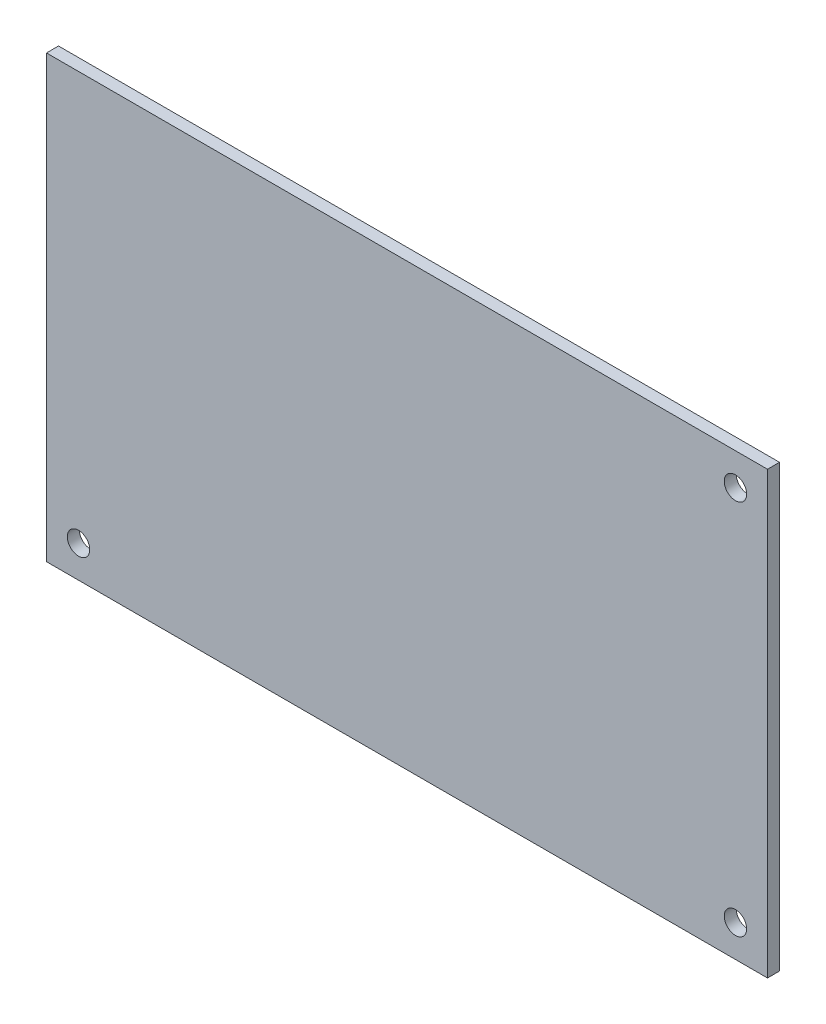
ISO-10303-21;
HEADER;
FILE_DESCRIPTION(('STEP AP214'),'2;1');
FILE_NAME('part.step','',(''),(''),'','','');
FILE_SCHEMA(('AUTOMOTIVE_DESIGN { 1 0 10303 214 1 1 1 1 }'));
ENDSEC;
DATA;
#1=APPLICATION_CONTEXT('core data for automotive mechanical design processes');
#2=APPLICATION_PROTOCOL_DEFINITION('international standard','automotive_design',2000,#1);
#3=PRODUCT_CONTEXT('',#1,'mechanical');
#4=PRODUCT('Part','Part','',(#3));
#5=PRODUCT_RELATED_PRODUCT_CATEGORY('part','',(#4));
#6=PRODUCT_DEFINITION_FORMATION('','',#4);
#7=PRODUCT_DEFINITION_CONTEXT('part definition',#1,'design');
#8=PRODUCT_DEFINITION('design','',#6,#7);
#9=PRODUCT_DEFINITION_SHAPE('','',#8);
#10=(LENGTH_UNIT() NAMED_UNIT(*) SI_UNIT(.MILLI.,.METRE.));
#11=(NAMED_UNIT(*) PLANE_ANGLE_UNIT() SI_UNIT($,.RADIAN.));
#12=(NAMED_UNIT(*) SI_UNIT($,.STERADIAN.) SOLID_ANGLE_UNIT());
#13=UNCERTAINTY_MEASURE_WITH_UNIT(LENGTH_MEASURE(1.E-05),#10,'distance_accuracy_value','');
#14=(GEOMETRIC_REPRESENTATION_CONTEXT(3) GLOBAL_UNCERTAINTY_ASSIGNED_CONTEXT((#13)) GLOBAL_UNIT_ASSIGNED_CONTEXT((#10,
#11,#12)) REPRESENTATION_CONTEXT('',''));
#15=CARTESIAN_POINT('',(0.,0.,0.));
#16=DIRECTION('',(0.,0.,1.));
#17=DIRECTION('',(1.,0.,0.));
#18=AXIS2_PLACEMENT_3D('',#15,#16,#17);
#19=CARTESIAN_POINT('',(45.,-27.5,1.5));
#20=DIRECTION('',(-1.,0.,0.));
#21=DIRECTION('',(0.,0.,1.));
#22=AXIS2_PLACEMENT_3D('',#19,#20,#21);
#23=PLANE('',#22);
#24=DIRECTION('',(0.,1.,0.));
#25=VECTOR('',#24,1.);
#26=CARTESIAN_POINT('',(45.,-27.5,0.));
#27=LINE('',#26,#25);
#28=CARTESIAN_POINT('',(45.,-27.5,0.));
#29=VERTEX_POINT('',#28);
#30=CARTESIAN_POINT('',(45.,27.5,0.));
#31=VERTEX_POINT('',#30);
#32=EDGE_CURVE('E96',#29,#31,#27,.T.);
#33=ORIENTED_EDGE('',*,*,#32,.T.);
#34=DIRECTION('',(0.,0.,-1.));
#35=VECTOR('',#34,1.);
#36=CARTESIAN_POINT('',(45.,27.5,1.5));
#37=LINE('',#36,#35);
#38=CARTESIAN_POINT('',(45.,27.5,1.5));
#39=VERTEX_POINT('',#38);
#40=EDGE_CURVE('E11',#39,#31,#37,.T.);
#41=ORIENTED_EDGE('',*,*,#40,.F.);
#42=DIRECTION('',(0.,1.,0.));
#43=VECTOR('',#42,1.);
#44=CARTESIAN_POINT('',(45.,-27.5,1.5));
#45=LINE('',#44,#43);
#46=CARTESIAN_POINT('',(45.,-27.5,1.5));
#47=VERTEX_POINT('',#46);
#48=EDGE_CURVE('E84',#47,#39,#45,.T.);
#49=ORIENTED_EDGE('',*,*,#48,.F.);
#50=DIRECTION('',(0.,0.,-1.));
#51=VECTOR('',#50,1.);
#52=CARTESIAN_POINT('',(45.,-27.5,1.5));
#53=LINE('',#52,#51);
#54=EDGE_CURVE('E92',#47,#29,#53,.T.);
#55=ORIENTED_EDGE('',*,*,#54,.T.);
#56=EDGE_LOOP('',(#33,#41,#49,#55));
#57=FACE_BOUND('',#56,.T.);
#58=ADVANCED_FACE('F33',(#57),#23,.F.);
#59=CARTESIAN_POINT('',(-45.,27.5,1.5));
#60=DIRECTION('',(0.,-1.,0.));
#61=DIRECTION('',(0.,0.,-1.));
#62=AXIS2_PLACEMENT_3D('',#59,#60,#61);
#63=PLANE('',#62);
#64=DIRECTION('',(-1.,0.,0.));
#65=VECTOR('',#64,1.);
#66=CARTESIAN_POINT('',(-45.,27.5,0.));
#67=LINE('',#66,#65);
#68=CARTESIAN_POINT('',(-45.,27.5,0.));
#69=VERTEX_POINT('',#68);
#70=EDGE_CURVE('E88',#31,#69,#67,.T.);
#71=ORIENTED_EDGE('',*,*,#70,.T.);
#72=DIRECTION('',(0.,0.,-1.));
#73=VECTOR('',#72,1.);
#74=CARTESIAN_POINT('',(-45.,27.5,1.5));
#75=LINE('',#74,#73);
#76=CARTESIAN_POINT('',(-45.,27.5,1.5));
#77=VERTEX_POINT('',#76);
#78=EDGE_CURVE('E41',#77,#69,#75,.T.);
#79=ORIENTED_EDGE('',*,*,#78,.F.);
#80=DIRECTION('',(-1.,0.,0.));
#81=VECTOR('',#80,1.);
#82=CARTESIAN_POINT('',(-45.,27.5,1.5));
#83=LINE('',#82,#81);
#84=EDGE_CURVE('E79',#39,#77,#83,.T.);
#85=ORIENTED_EDGE('',*,*,#84,.F.);
#86=ORIENTED_EDGE('',*,*,#40,.T.);
#87=EDGE_LOOP('',(#71,#79,#85,#86));
#88=FACE_BOUND('',#87,.T.);
#89=ADVANCED_FACE('F87',(#88),#63,.F.);
#90=CARTESIAN_POINT('',(-45.,-27.5,1.5));
#91=DIRECTION('',(1.,0.,0.));
#92=DIRECTION('',(0.,0.,-1.));
#93=AXIS2_PLACEMENT_3D('',#90,#91,#92);
#94=PLANE('',#93);
#95=DIRECTION('',(0.,-1.,0.));
#96=VECTOR('',#95,1.);
#97=CARTESIAN_POINT('',(-45.,-27.5,0.));
#98=LINE('',#97,#96);
#99=CARTESIAN_POINT('',(-45.,-27.5,0.));
#100=VERTEX_POINT('',#99);
#101=EDGE_CURVE('E66',#69,#100,#98,.T.);
#102=ORIENTED_EDGE('',*,*,#101,.T.);
#103=DIRECTION('',(0.,0.,-1.));
#104=VECTOR('',#103,1.);
#105=CARTESIAN_POINT('',(-45.,-27.5,1.5));
#106=LINE('',#105,#104);
#107=CARTESIAN_POINT('',(-45.,-27.5,1.5));
#108=VERTEX_POINT('',#107);
#109=EDGE_CURVE('E89',#108,#100,#106,.T.);
#110=ORIENTED_EDGE('',*,*,#109,.F.);
#111=DIRECTION('',(0.,-1.,0.));
#112=VECTOR('',#111,1.);
#113=CARTESIAN_POINT('',(-45.,-27.5,1.5));
#114=LINE('',#113,#112);
#115=EDGE_CURVE('E82',#77,#108,#114,.T.);
#116=ORIENTED_EDGE('',*,*,#115,.F.);
#117=ORIENTED_EDGE('',*,*,#78,.T.);
#118=EDGE_LOOP('',(#102,#110,#116,#117));
#119=FACE_BOUND('',#118,.T.);
#120=ADVANCED_FACE('F90',(#119),#94,.F.);
#121=CARTESIAN_POINT('',(-45.,-27.5,1.5));
#122=DIRECTION('',(0.,1.,0.));
#123=DIRECTION('',(0.,0.,1.));
#124=AXIS2_PLACEMENT_3D('',#121,#122,#123);
#125=PLANE('',#124);
#126=DIRECTION('',(1.,0.,0.));
#127=VECTOR('',#126,1.);
#128=CARTESIAN_POINT('',(-45.,-27.5,0.));
#129=LINE('',#128,#127);
#130=EDGE_CURVE('E72',#100,#29,#129,.T.);
#131=ORIENTED_EDGE('',*,*,#130,.T.);
#132=ORIENTED_EDGE('',*,*,#54,.F.);
#133=DIRECTION('',(1.,0.,0.));
#134=VECTOR('',#133,1.);
#135=CARTESIAN_POINT('',(-45.,-27.5,1.5));
#136=LINE('',#135,#134);
#137=EDGE_CURVE('E49',#108,#47,#136,.T.);
#138=ORIENTED_EDGE('',*,*,#137,.F.);
#139=ORIENTED_EDGE('',*,*,#109,.T.);
#140=EDGE_LOOP('',(#131,#132,#138,#139));
#141=FACE_BOUND('',#140,.T.);
#142=ADVANCED_FACE('F104',(#141),#125,.F.);
#143=CARTESIAN_POINT('',(0.,0.,1.5));
#144=DIRECTION('',(0.,0.,-1.));
#145=DIRECTION('',(-1.,0.,0.));
#146=AXIS2_PLACEMENT_3D('',#143,#144,#145);
#147=PLANE('',#146);
#148=CARTESIAN_POINT('',(-41.,-23.5,1.5));
#149=DIRECTION('',(0.,0.,1.));
#150=DIRECTION('',(1.,0.,0.));
#151=AXIS2_PLACEMENT_3D('',#148,#149,#150);
#152=CIRCLE('',#151,1.4);
#153=CARTESIAN_POINT('',(-39.6,-23.5,1.5));
#154=VERTEX_POINT('',#153);
#155=EDGE_CURVE('E122',#154,#154,#152,.T.);
#156=ORIENTED_EDGE('',*,*,#155,.F.);
#157=EDGE_LOOP('',(#156));
#158=FACE_BOUND('',#157,.T.);
#159=CARTESIAN_POINT('',(41.,23.5,1.5));
#160=DIRECTION('',(0.,0.,1.));
#161=DIRECTION('',(1.,0.,0.));
#162=AXIS2_PLACEMENT_3D('',#159,#160,#161);
#163=CIRCLE('',#162,1.4);
#164=CARTESIAN_POINT('',(42.4,23.5,1.5));
#165=VERTEX_POINT('',#164);
#166=EDGE_CURVE('E116',#165,#165,#163,.T.);
#167=ORIENTED_EDGE('',*,*,#166,.F.);
#168=EDGE_LOOP('',(#167));
#169=FACE_BOUND('',#168,.T.);
#170=CARTESIAN_POINT('',(41.,-23.5,1.5));
#171=DIRECTION('',(0.,0.,1.));
#172=DIRECTION('',(1.,0.,0.));
#173=AXIS2_PLACEMENT_3D('',#170,#171,#172);
#174=CIRCLE('',#173,1.4);
#175=CARTESIAN_POINT('',(42.4,-23.5,1.5));
#176=VERTEX_POINT('',#175);
#177=EDGE_CURVE('E110',#176,#176,#174,.T.);
#178=ORIENTED_EDGE('',*,*,#177,.F.);
#179=EDGE_LOOP('',(#178));
#180=FACE_BOUND('',#179,.T.);
#181=ORIENTED_EDGE('',*,*,#48,.T.);
#182=ORIENTED_EDGE('',*,*,#84,.T.);
#183=ORIENTED_EDGE('',*,*,#115,.T.);
#184=ORIENTED_EDGE('',*,*,#137,.T.);
#185=EDGE_LOOP('',(#181,#182,#183,#184));
#186=FACE_BOUND('',#185,.T.);
#187=ADVANCED_FACE('F80',(#158,#169,#180,#186),#147,.F.);
#188=CARTESIAN_POINT('',(0.,0.,0.));
#189=DIRECTION('',(0.,0.,-1.));
#190=DIRECTION('',(-1.,0.,0.));
#191=AXIS2_PLACEMENT_3D('',#188,#189,#190);
#192=PLANE('',#191);
#193=CARTESIAN_POINT('',(-41.,-23.5,0.));
#194=DIRECTION('',(0.,0.,1.));
#195=DIRECTION('',(1.,0.,0.));
#196=AXIS2_PLACEMENT_3D('',#193,#194,#195);
#197=CIRCLE('',#196,1.4);
#198=CARTESIAN_POINT('',(-39.6,-23.5,0.));
#199=VERTEX_POINT('',#198);
#200=EDGE_CURVE('E113',#199,#199,#197,.T.);
#201=ORIENTED_EDGE('',*,*,#200,.T.);
#202=EDGE_LOOP('',(#201));
#203=FACE_BOUND('',#202,.T.);
#204=CARTESIAN_POINT('',(41.,23.5,0.));
#205=DIRECTION('',(0.,0.,1.));
#206=DIRECTION('',(1.,0.,0.));
#207=AXIS2_PLACEMENT_3D('',#204,#205,#206);
#208=CIRCLE('',#207,1.4);
#209=CARTESIAN_POINT('',(42.4,23.5,0.));
#210=VERTEX_POINT('',#209);
#211=EDGE_CURVE('E119',#210,#210,#208,.T.);
#212=ORIENTED_EDGE('',*,*,#211,.T.);
#213=EDGE_LOOP('',(#212));
#214=FACE_BOUND('',#213,.T.);
#215=CARTESIAN_POINT('',(41.,-23.5,0.));
#216=DIRECTION('',(0.,0.,1.));
#217=DIRECTION('',(1.,0.,0.));
#218=AXIS2_PLACEMENT_3D('',#215,#216,#217);
#219=CIRCLE('',#218,1.4);
#220=CARTESIAN_POINT('',(42.4,-23.5,0.));
#221=VERTEX_POINT('',#220);
#222=EDGE_CURVE('E99',#221,#221,#219,.T.);
#223=ORIENTED_EDGE('',*,*,#222,.T.);
#224=EDGE_LOOP('',(#223));
#225=FACE_BOUND('',#224,.T.);
#226=ORIENTED_EDGE('',*,*,#32,.F.);
#227=ORIENTED_EDGE('',*,*,#130,.F.);
#228=ORIENTED_EDGE('',*,*,#101,.F.);
#229=ORIENTED_EDGE('',*,*,#70,.F.);
#230=EDGE_LOOP('',(#226,#227,#228,#229));
#231=FACE_BOUND('',#230,.T.);
#232=ADVANCED_FACE('F107',(#203,#214,#225,#231),#192,.T.);
#233=CARTESIAN_POINT('',(41.,-23.5,0.));
#234=DIRECTION('',(0.,0.,1.));
#235=DIRECTION('',(1.,0.,0.));
#236=AXIS2_PLACEMENT_3D('',#233,#234,#235);
#237=CYLINDRICAL_SURFACE('',#236,1.4);
#238=ORIENTED_EDGE('',*,*,#222,.F.);
#239=EDGE_LOOP('',(#238));
#240=FACE_BOUND('',#239,.T.);
#241=ORIENTED_EDGE('',*,*,#177,.T.);
#242=EDGE_LOOP('',(#241));
#243=FACE_BOUND('',#242,.T.);
#244=ADVANCED_FACE('F144',(#240,#243),#237,.F.);
#245=CARTESIAN_POINT('',(41.,23.5,0.));
#246=DIRECTION('',(0.,0.,1.));
#247=DIRECTION('',(1.,0.,0.));
#248=AXIS2_PLACEMENT_3D('',#245,#246,#247);
#249=CYLINDRICAL_SURFACE('',#248,1.4);
#250=ORIENTED_EDGE('',*,*,#211,.F.);
#251=EDGE_LOOP('',(#250));
#252=FACE_BOUND('',#251,.T.);
#253=ORIENTED_EDGE('',*,*,#166,.T.);
#254=EDGE_LOOP('',(#253));
#255=FACE_BOUND('',#254,.T.);
#256=ADVANCED_FACE('F133',(#252,#255),#249,.F.);
#257=CARTESIAN_POINT('',(-41.,-23.5,0.));
#258=DIRECTION('',(0.,0.,1.));
#259=DIRECTION('',(1.,0.,0.));
#260=AXIS2_PLACEMENT_3D('',#257,#258,#259);
#261=CYLINDRICAL_SURFACE('',#260,1.4);
#262=ORIENTED_EDGE('',*,*,#200,.F.);
#263=EDGE_LOOP('',(#262));
#264=FACE_BOUND('',#263,.T.);
#265=ORIENTED_EDGE('',*,*,#155,.T.);
#266=EDGE_LOOP('',(#265));
#267=FACE_BOUND('',#266,.T.);
#268=ADVANCED_FACE('F130',(#264,#267),#261,.F.);
#269=CLOSED_SHELL('',(#58,#89,#120,#142,#187,#232,#244,#256,#268));
#270=MANIFOLD_SOLID_BREP('B2',#269);
#271=ADVANCED_BREP_SHAPE_REPRESENTATION('',(#18,#270),#14);
#272=SHAPE_DEFINITION_REPRESENTATION(#9,#271);
ENDSEC;
END-ISO-10303-21;
